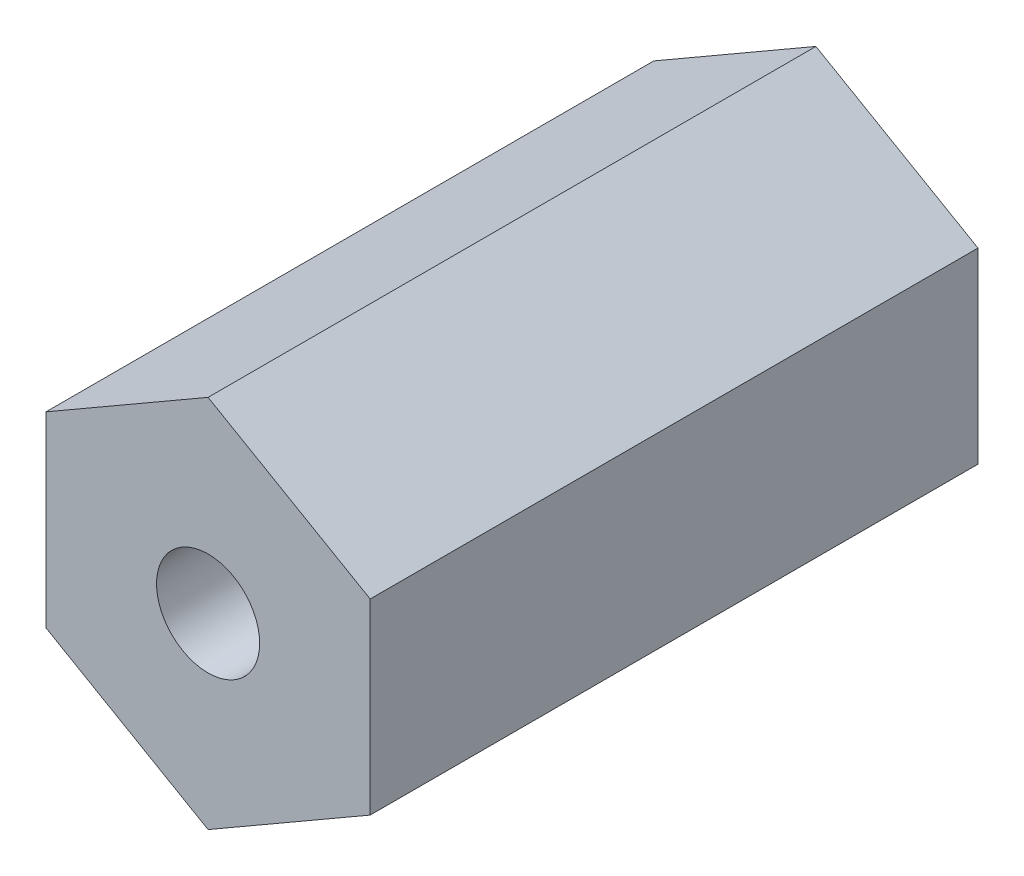
ISO-10303-21;
HEADER;
FILE_DESCRIPTION(('STEP AP214'),'2;1');
FILE_NAME('part.step','',(''),(''),'','','');
FILE_SCHEMA(('AUTOMOTIVE_DESIGN { 1 0 10303 214 1 1 1 1 }'));
ENDSEC;
DATA;
#1=APPLICATION_CONTEXT('core data for automotive mechanical design processes');
#2=APPLICATION_PROTOCOL_DEFINITION('international standard','automotive_design',2000,#1);
#3=PRODUCT_CONTEXT('',#1,'mechanical');
#4=PRODUCT('Part','Part','',(#3));
#5=PRODUCT_RELATED_PRODUCT_CATEGORY('part','',(#4));
#6=PRODUCT_DEFINITION_FORMATION('','',#4);
#7=PRODUCT_DEFINITION_CONTEXT('part definition',#1,'design');
#8=PRODUCT_DEFINITION('design','',#6,#7);
#9=PRODUCT_DEFINITION_SHAPE('','',#8);
#10=(LENGTH_UNIT() NAMED_UNIT(*) SI_UNIT(.MILLI.,.METRE.));
#11=(NAMED_UNIT(*) PLANE_ANGLE_UNIT() SI_UNIT($,.RADIAN.));
#12=(NAMED_UNIT(*) SI_UNIT($,.STERADIAN.) SOLID_ANGLE_UNIT());
#13=UNCERTAINTY_MEASURE_WITH_UNIT(LENGTH_MEASURE(1.E-05),#10,'distance_accuracy_value','');
#14=(GEOMETRIC_REPRESENTATION_CONTEXT(3) GLOBAL_UNCERTAINTY_ASSIGNED_CONTEXT((#13)) GLOBAL_UNIT_ASSIGNED_CONTEXT((#10,
#11,#12)) REPRESENTATION_CONTEXT('',''));
#15=CARTESIAN_POINT('',(0.,0.,0.));
#16=DIRECTION('',(0.,0.,1.));
#17=DIRECTION('',(1.,0.,0.));
#18=AXIS2_PLACEMENT_3D('',#15,#16,#17);
#19=CARTESIAN_POINT('',(0.,0.,23.8125));
#20=DIRECTION('',(0.,0.,1.));
#21=DIRECTION('',(1.,0.,0.));
#22=AXIS2_PLACEMENT_3D('',#19,#20,#21);
#23=PLANE('',#22);
#24=DIRECTION('',(-0.866025403784441,0.499999999999995,0.));
#25=VECTOR('',#24,1.);
#26=CARTESIAN_POINT('',(6.34999999999995,3.66617420935419,23.8125));
#27=LINE('',#26,#25);
#28=CARTESIAN_POINT('',(6.34999999999995,3.66617420935419,23.8125));
#29=VERTEX_POINT('',#28);
#30=CARTESIAN_POINT('',(0.,7.33234841870824,23.8125));
#31=VERTEX_POINT('',#30);
#32=EDGE_CURVE('E131',#29,#31,#27,.T.);
#33=ORIENTED_EDGE('',*,*,#32,.T.);
#34=DIRECTION('',(-0.866025403784438,-0.500000000000001,0.));
#35=VECTOR('',#34,1.);
#36=CARTESIAN_POINT('',(0.,7.33234841870824,23.8125));
#37=LINE('',#36,#35);
#38=CARTESIAN_POINT('',(-6.35,3.6661742093541,23.8125));
#39=VERTEX_POINT('',#38);
#40=EDGE_CURVE('E89',#31,#39,#37,.T.);
#41=ORIENTED_EDGE('',*,*,#40,.T.);
#42=DIRECTION('',(0.,-1.,0.));
#43=VECTOR('',#42,1.);
#44=CARTESIAN_POINT('',(-6.35,3.6661742093541,23.8125));
#45=LINE('',#44,#43);
#46=CARTESIAN_POINT('',(-6.34999999999997,-3.66617420935415,23.8125));
#47=VERTEX_POINT('',#46);
#48=EDGE_CURVE('E102',#39,#47,#45,.T.);
#49=ORIENTED_EDGE('',*,*,#48,.T.);
#50=DIRECTION('',(0.866025403784442,-0.499999999999995,0.));
#51=VECTOR('',#50,1.);
#52=CARTESIAN_POINT('',(-6.34999999999997,-3.66617420935415,23.8125));
#53=LINE('',#52,#51);
#54=CARTESIAN_POINT('',(0.,-7.33234841870824,23.8125));
#55=VERTEX_POINT('',#54);
#56=EDGE_CURVE('E96',#47,#55,#53,.T.);
#57=ORIENTED_EDGE('',*,*,#56,.T.);
#58=DIRECTION('',(0.866025403784435,0.500000000000007,0.));
#59=VECTOR('',#58,1.);
#60=CARTESIAN_POINT('',(0.,-7.33234841870824,23.8125));
#61=LINE('',#60,#59);
#62=CARTESIAN_POINT('',(6.35000000000002,-3.66617420935406,23.8125));
#63=VERTEX_POINT('',#62);
#64=EDGE_CURVE('E100',#55,#63,#61,.T.);
#65=ORIENTED_EDGE('',*,*,#64,.T.);
#66=DIRECTION('',(0.,1.,0.));
#67=VECTOR('',#66,1.);
#68=CARTESIAN_POINT('',(6.35000000000002,-3.66617420935406,23.8125));
#69=LINE('',#68,#67);
#70=EDGE_CURVE('E52',#63,#29,#69,.T.);
#71=ORIENTED_EDGE('',*,*,#70,.T.);
#72=EDGE_LOOP('',(#33,#41,#49,#57,#65,#71));
#73=FACE_BOUND('',#72,.T.);
#74=CARTESIAN_POINT('',(0.,0.,23.8125));
#75=DIRECTION('',(0.,0.,1.));
#76=DIRECTION('',(1.,0.,0.));
#77=AXIS2_PLACEMENT_3D('',#74,#75,#76);
#78=CIRCLE('',#77,2.0193);
#79=CARTESIAN_POINT('',(2.0193,0.,23.8125));
#80=VERTEX_POINT('',#79);
#81=EDGE_CURVE('E124',#80,#80,#78,.T.);
#82=ORIENTED_EDGE('',*,*,#81,.F.);
#83=EDGE_LOOP('',(#82));
#84=FACE_BOUND('',#83,.T.);
#85=ADVANCED_FACE('F35',(#73,#84),#23,.T.);
#86=CARTESIAN_POINT('',(0.,0.,0.));
#87=DIRECTION('',(0.,0.,1.));
#88=DIRECTION('',(1.,0.,0.));
#89=AXIS2_PLACEMENT_3D('',#86,#87,#88);
#90=PLANE('',#89);
#91=DIRECTION('',(-0.866025403784441,0.499999999999995,0.));
#92=VECTOR('',#91,1.);
#93=CARTESIAN_POINT('',(6.34999999999995,3.66617420935419,0.));
#94=LINE('',#93,#92);
#95=CARTESIAN_POINT('',(6.34999999999995,3.66617420935419,0.));
#96=VERTEX_POINT('',#95);
#97=CARTESIAN_POINT('',(0.,7.33234841870824,0.));
#98=VERTEX_POINT('',#97);
#99=EDGE_CURVE('E120',#96,#98,#94,.T.);
#100=ORIENTED_EDGE('',*,*,#99,.F.);
#101=DIRECTION('',(0.,1.,0.));
#102=VECTOR('',#101,1.);
#103=CARTESIAN_POINT('',(6.35000000000002,-3.66617420935406,0.));
#104=LINE('',#103,#102);
#105=CARTESIAN_POINT('',(6.35000000000002,-3.66617420935406,0.));
#106=VERTEX_POINT('',#105);
#107=EDGE_CURVE('E81',#106,#96,#104,.T.);
#108=ORIENTED_EDGE('',*,*,#107,.F.);
#109=DIRECTION('',(0.866025403784435,0.500000000000007,0.));
#110=VECTOR('',#109,1.);
#111=CARTESIAN_POINT('',(0.,-7.33234841870824,0.));
#112=LINE('',#111,#110);
#113=CARTESIAN_POINT('',(0.,-7.33234841870824,0.));
#114=VERTEX_POINT('',#113);
#115=EDGE_CURVE('E75',#114,#106,#112,.T.);
#116=ORIENTED_EDGE('',*,*,#115,.F.);
#117=DIRECTION('',(0.866025403784442,-0.499999999999995,0.));
#118=VECTOR('',#117,1.);
#119=CARTESIAN_POINT('',(-6.34999999999997,-3.66617420935415,0.));
#120=LINE('',#119,#118);
#121=CARTESIAN_POINT('',(-6.34999999999997,-3.66617420935415,0.));
#122=VERTEX_POINT('',#121);
#123=EDGE_CURVE('E110',#122,#114,#120,.T.);
#124=ORIENTED_EDGE('',*,*,#123,.F.);
#125=DIRECTION('',(0.,-1.,0.));
#126=VECTOR('',#125,1.);
#127=CARTESIAN_POINT('',(-6.35,3.6661742093541,0.));
#128=LINE('',#127,#126);
#129=CARTESIAN_POINT('',(-6.35,3.6661742093541,0.));
#130=VERTEX_POINT('',#129);
#131=EDGE_CURVE('E126',#130,#122,#128,.T.);
#132=ORIENTED_EDGE('',*,*,#131,.F.);
#133=DIRECTION('',(-0.866025403784438,-0.500000000000001,0.));
#134=VECTOR('',#133,1.);
#135=CARTESIAN_POINT('',(0.,7.33234841870824,0.));
#136=LINE('',#135,#134);
#137=EDGE_CURVE('E123',#98,#130,#136,.T.);
#138=ORIENTED_EDGE('',*,*,#137,.F.);
#139=EDGE_LOOP('',(#100,#108,#116,#124,#132,#138));
#140=FACE_BOUND('',#139,.T.);
#141=CARTESIAN_POINT('',(0.,0.,0.));
#142=DIRECTION('',(0.,0.,1.));
#143=DIRECTION('',(1.,0.,0.));
#144=AXIS2_PLACEMENT_3D('',#141,#142,#143);
#145=CIRCLE('',#144,2.0193);
#146=CARTESIAN_POINT('',(2.0193,0.,0.));
#147=VERTEX_POINT('',#146);
#148=EDGE_CURVE('E224',#147,#147,#145,.T.);
#149=ORIENTED_EDGE('',*,*,#148,.T.);
#150=EDGE_LOOP('',(#149));
#151=FACE_BOUND('',#150,.T.);
#152=ADVANCED_FACE('F140',(#140,#151),#90,.F.);
#153=CARTESIAN_POINT('',(6.34999999999995,3.66617420935419,23.8125));
#154=DIRECTION('',(-0.499999999999995,-0.866025403784441,0.));
#155=DIRECTION('',(0.866025403784441,-0.499999999999995,0.));
#156=AXIS2_PLACEMENT_3D('',#153,#154,#155);
#157=PLANE('',#156);
#158=ORIENTED_EDGE('',*,*,#99,.T.);
#159=DIRECTION('',(0.,0.,-1.));
#160=VECTOR('',#159,1.);
#161=CARTESIAN_POINT('',(0.,7.33234841870824,23.8125));
#162=LINE('',#161,#160);
#163=EDGE_CURVE('E11',#31,#98,#162,.T.);
#164=ORIENTED_EDGE('',*,*,#163,.F.);
#165=ORIENTED_EDGE('',*,*,#32,.F.);
#166=DIRECTION('',(0.,0.,-1.));
#167=VECTOR('',#166,1.);
#168=CARTESIAN_POINT('',(6.34999999999995,3.66617420935419,23.8125));
#169=LINE('',#168,#167);
#170=EDGE_CURVE('E116',#29,#96,#169,.T.);
#171=ORIENTED_EDGE('',*,*,#170,.T.);
#172=EDGE_LOOP('',(#158,#164,#165,#171));
#173=FACE_BOUND('',#172,.T.);
#174=ADVANCED_FACE('F37',(#173),#157,.F.);
#175=CARTESIAN_POINT('',(0.,7.33234841870824,23.8125));
#176=DIRECTION('',(0.500000000000001,-0.866025403784438,0.));
#177=DIRECTION('',(0.866025403784438,0.500000000000001,0.));
#178=AXIS2_PLACEMENT_3D('',#175,#176,#177);
#179=PLANE('',#178);
#180=ORIENTED_EDGE('',*,*,#137,.T.);
#181=DIRECTION('',(0.,0.,-1.));
#182=VECTOR('',#181,1.);
#183=CARTESIAN_POINT('',(-6.35,3.6661742093541,23.8125));
#184=LINE('',#183,#182);
#185=EDGE_CURVE('E44',#39,#130,#184,.T.);
#186=ORIENTED_EDGE('',*,*,#185,.F.);
#187=ORIENTED_EDGE('',*,*,#40,.F.);
#188=ORIENTED_EDGE('',*,*,#163,.T.);
#189=EDGE_LOOP('',(#180,#186,#187,#188));
#190=FACE_BOUND('',#189,.T.);
#191=ADVANCED_FACE('F165',(#190),#179,.F.);
#192=CARTESIAN_POINT('',(-6.35,3.6661742093541,23.8125));
#193=DIRECTION('',(1.,0.,0.));
#194=DIRECTION('',(0.,1.,0.));
#195=AXIS2_PLACEMENT_3D('',#192,#193,#194);
#196=PLANE('',#195);
#197=ORIENTED_EDGE('',*,*,#131,.T.);
#198=DIRECTION('',(0.,0.,-1.));
#199=VECTOR('',#198,1.);
#200=CARTESIAN_POINT('',(-6.34999999999997,-3.66617420935415,23.8125));
#201=LINE('',#200,#199);
#202=EDGE_CURVE('E111',#47,#122,#201,.T.);
#203=ORIENTED_EDGE('',*,*,#202,.F.);
#204=ORIENTED_EDGE('',*,*,#48,.F.);
#205=ORIENTED_EDGE('',*,*,#185,.T.);
#206=EDGE_LOOP('',(#197,#203,#204,#205));
#207=FACE_BOUND('',#206,.T.);
#208=ADVANCED_FACE('F137',(#207),#196,.F.);
#209=CARTESIAN_POINT('',(-6.34999999999997,-3.66617420935415,23.8125));
#210=DIRECTION('',(0.499999999999995,0.866025403784441,0.));
#211=DIRECTION('',(-0.866025403784442,0.499999999999995,0.));
#212=AXIS2_PLACEMENT_3D('',#209,#210,#211);
#213=PLANE('',#212);
#214=ORIENTED_EDGE('',*,*,#123,.T.);
#215=DIRECTION('',(0.,0.,-1.));
#216=VECTOR('',#215,1.);
#217=CARTESIAN_POINT('',(0.,-7.33234841870824,23.8125));
#218=LINE('',#217,#216);
#219=EDGE_CURVE('E107',#55,#114,#218,.T.);
#220=ORIENTED_EDGE('',*,*,#219,.F.);
#221=ORIENTED_EDGE('',*,*,#56,.F.);
#222=ORIENTED_EDGE('',*,*,#202,.T.);
#223=EDGE_LOOP('',(#214,#220,#221,#222));
#224=FACE_BOUND('',#223,.T.);
#225=ADVANCED_FACE('F108',(#224),#213,.F.);
#226=CARTESIAN_POINT('',(0.,-7.33234841870824,23.8125));
#227=DIRECTION('',(-0.500000000000007,0.866025403784434,0.));
#228=DIRECTION('',(-0.866025403784435,-0.500000000000007,0.));
#229=AXIS2_PLACEMENT_3D('',#226,#227,#228);
#230=PLANE('',#229);
#231=ORIENTED_EDGE('',*,*,#115,.T.);
#232=DIRECTION('',(0.,0.,-1.));
#233=VECTOR('',#232,1.);
#234=CARTESIAN_POINT('',(6.35000000000002,-3.66617420935406,23.8125));
#235=LINE('',#234,#233);
#236=EDGE_CURVE('E112',#63,#106,#235,.T.);
#237=ORIENTED_EDGE('',*,*,#236,.F.);
#238=ORIENTED_EDGE('',*,*,#64,.F.);
#239=ORIENTED_EDGE('',*,*,#219,.T.);
#240=EDGE_LOOP('',(#231,#237,#238,#239));
#241=FACE_BOUND('',#240,.T.);
#242=ADVANCED_FACE('F114',(#241),#230,.F.);
#243=CARTESIAN_POINT('',(6.35000000000002,-3.66617420935406,23.8125));
#244=DIRECTION('',(-1.,0.,0.));
#245=DIRECTION('',(0.,-1.,0.));
#246=AXIS2_PLACEMENT_3D('',#243,#244,#245);
#247=PLANE('',#246);
#248=ORIENTED_EDGE('',*,*,#107,.T.);
#249=ORIENTED_EDGE('',*,*,#170,.F.);
#250=ORIENTED_EDGE('',*,*,#70,.F.);
#251=ORIENTED_EDGE('',*,*,#236,.T.);
#252=EDGE_LOOP('',(#248,#249,#250,#251));
#253=FACE_BOUND('',#252,.T.);
#254=ADVANCED_FACE('F145',(#253),#247,.F.);
#255=CARTESIAN_POINT('',(0.,0.,23.8125));
#256=DIRECTION('',(0.,0.,-1.));
#257=DIRECTION('',(-1.,0.,0.));
#258=AXIS2_PLACEMENT_3D('',#255,#256,#257);
#259=CYLINDRICAL_SURFACE('',#258,2.0193);
#260=ORIENTED_EDGE('',*,*,#81,.T.);
#261=EDGE_LOOP('',(#260));
#262=FACE_BOUND('',#261,.T.);
#263=ORIENTED_EDGE('',*,*,#148,.F.);
#264=EDGE_LOOP('',(#263));
#265=FACE_BOUND('',#264,.T.);
#266=ADVANCED_FACE('F147',(#262,#265),#259,.F.);
#267=CLOSED_SHELL('',(#85,#152,#174,#191,#208,#225,#242,#254,#266));
#268=MANIFOLD_SOLID_BREP('B2',#267);
#269=ADVANCED_BREP_SHAPE_REPRESENTATION('',(#18,#268),#14);
#270=SHAPE_DEFINITION_REPRESENTATION(#9,#269);
ENDSEC;
END-ISO-10303-21;
